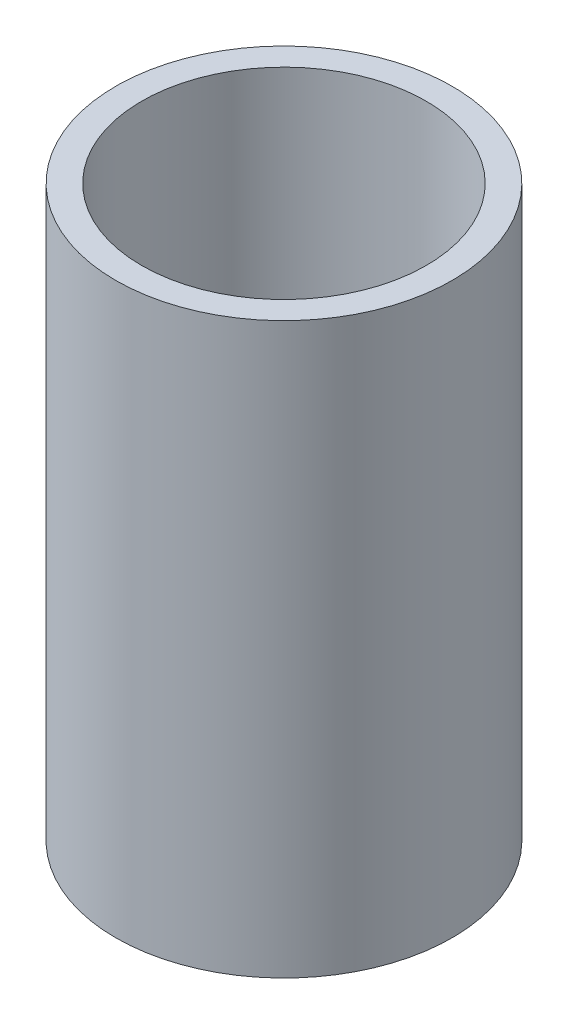
ISO-10303-21;
HEADER;
FILE_DESCRIPTION(('STEP AP214'),'2;1');
FILE_NAME('part.step','',(''),(''),'','','');
FILE_SCHEMA(('AUTOMOTIVE_DESIGN { 1 0 10303 214 1 1 1 1 }'));
ENDSEC;
DATA;
#1=APPLICATION_CONTEXT('core data for automotive mechanical design processes');
#2=APPLICATION_PROTOCOL_DEFINITION('international standard','automotive_design',2000,#1);
#3=PRODUCT_CONTEXT('',#1,'mechanical');
#4=PRODUCT('Part','Part','',(#3));
#5=PRODUCT_RELATED_PRODUCT_CATEGORY('part','',(#4));
#6=PRODUCT_DEFINITION_FORMATION('','',#4);
#7=PRODUCT_DEFINITION_CONTEXT('part definition',#1,'design');
#8=PRODUCT_DEFINITION('design','',#6,#7);
#9=PRODUCT_DEFINITION_SHAPE('','',#8);
#10=(LENGTH_UNIT() NAMED_UNIT(*) SI_UNIT(.MILLI.,.METRE.));
#11=(NAMED_UNIT(*) PLANE_ANGLE_UNIT() SI_UNIT($,.RADIAN.));
#12=(NAMED_UNIT(*) SI_UNIT($,.STERADIAN.) SOLID_ANGLE_UNIT());
#13=UNCERTAINTY_MEASURE_WITH_UNIT(LENGTH_MEASURE(1.E-05),#10,'distance_accuracy_value','');
#14=(GEOMETRIC_REPRESENTATION_CONTEXT(3) GLOBAL_UNCERTAINTY_ASSIGNED_CONTEXT((#13)) GLOBAL_UNIT_ASSIGNED_CONTEXT((#10,
#11,#12)) REPRESENTATION_CONTEXT('',''));
#15=CARTESIAN_POINT('',(0.,0.,0.));
#16=DIRECTION('',(0.,0.,1.));
#17=DIRECTION('',(1.,0.,0.));
#18=AXIS2_PLACEMENT_3D('',#15,#16,#17);
#19=CARTESIAN_POINT('',(0.,11.,0.));
#20=DIRECTION('',(0.,1.,0.));
#21=DIRECTION('',(0.,0.,1.));
#22=AXIS2_PLACEMENT_3D('',#19,#20,#21);
#23=PLANE('',#22);
#24=CARTESIAN_POINT('',(0.,11.,0.));
#25=DIRECTION('',(0.,1.,0.));
#26=DIRECTION('',(0.,0.,1.));
#27=AXIS2_PLACEMENT_3D('',#24,#25,#26);
#28=CIRCLE('',#27,3.25);
#29=CARTESIAN_POINT('',(0.,11.,3.25));
#30=VERTEX_POINT('',#29);
#31=EDGE_CURVE('E10',#30,#30,#28,.T.);
#32=ORIENTED_EDGE('',*,*,#31,.T.);
#33=EDGE_LOOP('',(#32));
#34=FACE_BOUND('',#33,.T.);
#35=CARTESIAN_POINT('',(0.,11.,0.));
#36=DIRECTION('',(0.,1.,0.));
#37=DIRECTION('',(0.,0.,1.));
#38=AXIS2_PLACEMENT_3D('',#35,#36,#37);
#39=CIRCLE('',#38,2.75);
#40=CARTESIAN_POINT('',(0.,11.,2.75));
#41=VERTEX_POINT('',#40);
#42=EDGE_CURVE('E42',#41,#41,#39,.T.);
#43=ORIENTED_EDGE('',*,*,#42,.F.);
#44=EDGE_LOOP('',(#43));
#45=FACE_BOUND('',#44,.T.);
#46=ADVANCED_FACE('F31',(#34,#45),#23,.T.);
#47=CARTESIAN_POINT('',(0.,0.,0.));
#48=DIRECTION('',(0.,1.,0.));
#49=DIRECTION('',(0.,0.,1.));
#50=AXIS2_PLACEMENT_3D('',#47,#48,#49);
#51=PLANE('',#50);
#52=CARTESIAN_POINT('',(0.,0.,0.));
#53=DIRECTION('',(0.,1.,0.));
#54=DIRECTION('',(0.,0.,1.));
#55=AXIS2_PLACEMENT_3D('',#52,#53,#54);
#56=CIRCLE('',#55,3.25);
#57=CARTESIAN_POINT('',(0.,0.,3.25));
#58=VERTEX_POINT('',#57);
#59=EDGE_CURVE('E35',#58,#58,#56,.T.);
#60=ORIENTED_EDGE('',*,*,#59,.F.);
#61=EDGE_LOOP('',(#60));
#62=FACE_BOUND('',#61,.T.);
#63=CARTESIAN_POINT('',(0.,0.,0.));
#64=DIRECTION('',(0.,1.,0.));
#65=DIRECTION('',(0.,0.,1.));
#66=AXIS2_PLACEMENT_3D('',#63,#64,#65);
#67=CIRCLE('',#66,2.75);
#68=CARTESIAN_POINT('',(0.,0.,2.75));
#69=VERTEX_POINT('',#68);
#70=EDGE_CURVE('E44',#69,#69,#67,.T.);
#71=ORIENTED_EDGE('',*,*,#70,.T.);
#72=EDGE_LOOP('',(#71));
#73=FACE_BOUND('',#72,.T.);
#74=ADVANCED_FACE('F54',(#62,#73),#51,.F.);
#75=CARTESIAN_POINT('',(0.,11.,0.));
#76=DIRECTION('',(0.,-1.,0.));
#77=DIRECTION('',(0.,0.,-1.));
#78=AXIS2_PLACEMENT_3D('',#75,#76,#77);
#79=CYLINDRICAL_SURFACE('',#78,3.25);
#80=ORIENTED_EDGE('',*,*,#31,.F.);
#81=EDGE_LOOP('',(#80));
#82=FACE_BOUND('',#81,.T.);
#83=ORIENTED_EDGE('',*,*,#59,.T.);
#84=EDGE_LOOP('',(#83));
#85=FACE_BOUND('',#84,.T.);
#86=ADVANCED_FACE('F33',(#82,#85),#79,.T.);
#87=CARTESIAN_POINT('',(0.,11.,0.));
#88=DIRECTION('',(0.,-1.,0.));
#89=DIRECTION('',(0.,0.,-1.));
#90=AXIS2_PLACEMENT_3D('',#87,#88,#89);
#91=CYLINDRICAL_SURFACE('',#90,2.75);
#92=ORIENTED_EDGE('',*,*,#42,.T.);
#93=EDGE_LOOP('',(#92));
#94=FACE_BOUND('',#93,.T.);
#95=ORIENTED_EDGE('',*,*,#70,.F.);
#96=EDGE_LOOP('',(#95));
#97=FACE_BOUND('',#96,.T.);
#98=ADVANCED_FACE('F50',(#94,#97),#91,.F.);
#99=CLOSED_SHELL('',(#46,#74,#86,#98));
#100=MANIFOLD_SOLID_BREP('B2',#99);
#101=ADVANCED_BREP_SHAPE_REPRESENTATION('',(#18,#100),#14);
#102=SHAPE_DEFINITION_REPRESENTATION(#9,#101);
ENDSEC;
END-ISO-10303-21;
